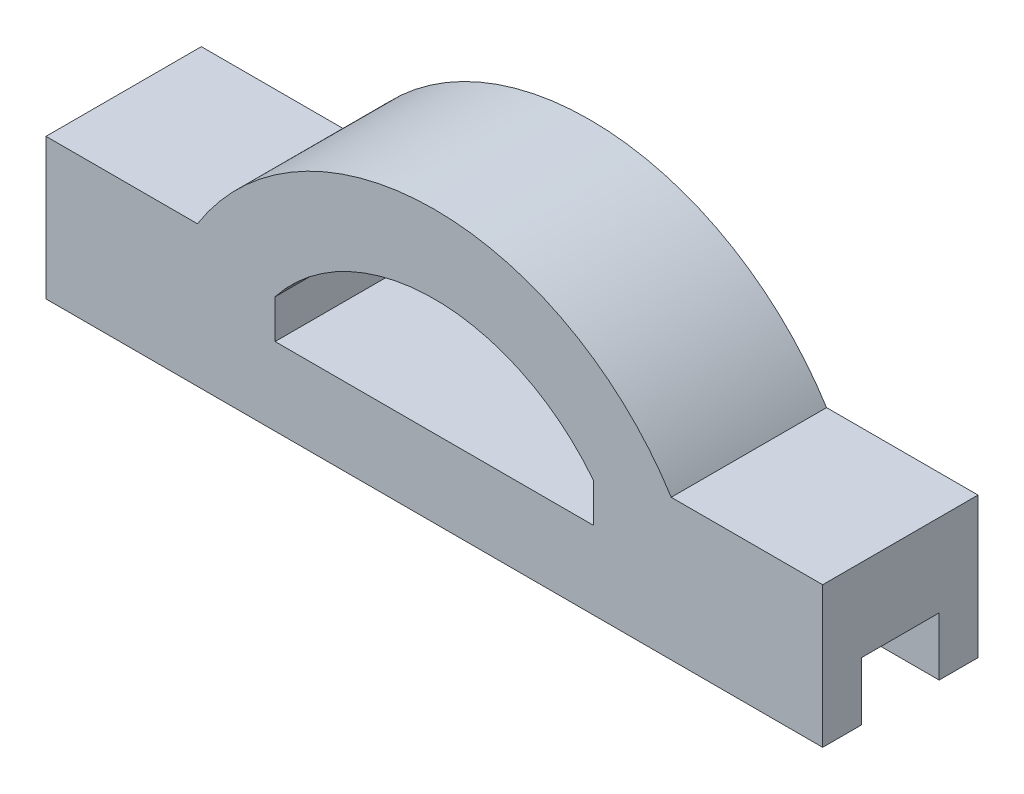
ISO-10303-21;
HEADER;
FILE_DESCRIPTION(('STEP AP214'),'2;1');
FILE_NAME('part.step','',(''),(''),'','','');
FILE_SCHEMA(('AUTOMOTIVE_DESIGN { 1 0 10303 214 1 1 1 1 }'));
ENDSEC;
DATA;
#1=APPLICATION_CONTEXT('core data for automotive mechanical design processes');
#2=APPLICATION_PROTOCOL_DEFINITION('international standard','automotive_design',2000,#1);
#3=PRODUCT_CONTEXT('',#1,'mechanical');
#4=PRODUCT('Part','Part','',(#3));
#5=PRODUCT_RELATED_PRODUCT_CATEGORY('part','',(#4));
#6=PRODUCT_DEFINITION_FORMATION('','',#4);
#7=PRODUCT_DEFINITION_CONTEXT('part definition',#1,'design');
#8=PRODUCT_DEFINITION('design','',#6,#7);
#9=PRODUCT_DEFINITION_SHAPE('','',#8);
#10=(LENGTH_UNIT() NAMED_UNIT(*) SI_UNIT(.MILLI.,.METRE.));
#11=(NAMED_UNIT(*) PLANE_ANGLE_UNIT() SI_UNIT($,.RADIAN.));
#12=(NAMED_UNIT(*) SI_UNIT($,.STERADIAN.) SOLID_ANGLE_UNIT());
#13=UNCERTAINTY_MEASURE_WITH_UNIT(LENGTH_MEASURE(1.E-05),#10,'distance_accuracy_value','');
#14=(GEOMETRIC_REPRESENTATION_CONTEXT(3) GLOBAL_UNCERTAINTY_ASSIGNED_CONTEXT((#13)) GLOBAL_UNIT_ASSIGNED_CONTEXT((#10,
#11,#12)) REPRESENTATION_CONTEXT('',''));
#15=CARTESIAN_POINT('',(0.,0.,0.));
#16=DIRECTION('',(0.,0.,1.));
#17=DIRECTION('',(1.,0.,0.));
#18=AXIS2_PLACEMENT_3D('',#15,#16,#17);
#19=CARTESIAN_POINT('',(20.,0.,-2.));
#20=DIRECTION('',(1.,0.,0.));
#21=DIRECTION('',(0.,0.,-1.));
#22=AXIS2_PLACEMENT_3D('',#19,#20,#21);
#23=PLANE('',#22);
#24=DIRECTION('',(0.,0.,-1.));
#25=VECTOR('',#24,1.);
#26=CARTESIAN_POINT('',(20.,1.5,1.));
#27=LINE('',#26,#25);
#28=CARTESIAN_POINT('',(20.,1.5,1.));
#29=VERTEX_POINT('',#28);
#30=CARTESIAN_POINT('',(20.,1.5,-1.));
#31=VERTEX_POINT('',#30);
#32=EDGE_CURVE('E184',#29,#31,#27,.T.);
#33=ORIENTED_EDGE('',*,*,#32,.T.);
#34=DIRECTION('',(0.,-1.,0.));
#35=VECTOR('',#34,1.);
#36=CARTESIAN_POINT('',(20.,0.,-1.));
#37=LINE('',#36,#35);
#38=CARTESIAN_POINT('',(20.,0.,-1.));
#39=VERTEX_POINT('',#38);
#40=EDGE_CURVE('E175',#31,#39,#37,.T.);
#41=ORIENTED_EDGE('',*,*,#40,.T.);
#42=DIRECTION('',(0.,0.,1.));
#43=VECTOR('',#42,1.);
#44=CARTESIAN_POINT('',(20.,0.,-2.));
#45=LINE('',#44,#43);
#46=CARTESIAN_POINT('',(20.,0.,-2.));
#47=VERTEX_POINT('',#46);
#48=EDGE_CURVE('E295',#47,#39,#45,.T.);
#49=ORIENTED_EDGE('',*,*,#48,.F.);
#50=DIRECTION('',(0.,1.,0.));
#51=VECTOR('',#50,1.);
#52=CARTESIAN_POINT('',(20.,0.,-2.));
#53=LINE('',#52,#51);
#54=CARTESIAN_POINT('',(20.,3.62712220721575,-2.));
#55=VERTEX_POINT('',#54);
#56=EDGE_CURVE('E278',#47,#55,#53,.T.);
#57=ORIENTED_EDGE('',*,*,#56,.T.);
#58=DIRECTION('',(0.,0.,1.));
#59=VECTOR('',#58,1.);
#60=CARTESIAN_POINT('',(20.,3.62712220721575,-2.));
#61=LINE('',#60,#59);
#62=CARTESIAN_POINT('',(20.,3.62712220721575,2.));
#63=VERTEX_POINT('',#62);
#64=EDGE_CURVE('E294',#55,#63,#61,.T.);
#65=ORIENTED_EDGE('',*,*,#64,.T.);
#66=DIRECTION('',(0.,1.,0.));
#67=VECTOR('',#66,1.);
#68=CARTESIAN_POINT('',(20.,0.,2.));
#69=LINE('',#68,#67);
#70=CARTESIAN_POINT('',(20.,0.,2.));
#71=VERTEX_POINT('',#70);
#72=EDGE_CURVE('E240',#71,#63,#69,.T.);
#73=ORIENTED_EDGE('',*,*,#72,.F.);
#74=CARTESIAN_POINT('',(20.,0.,1.));
#75=VERTEX_POINT('',#74);
#76=EDGE_CURVE('E297',#75,#71,#45,.T.);
#77=ORIENTED_EDGE('',*,*,#76,.F.);
#78=DIRECTION('',(0.,1.,0.));
#79=VECTOR('',#78,1.);
#80=CARTESIAN_POINT('',(20.,0.,1.));
#81=LINE('',#80,#79);
#82=EDGE_CURVE('E181',#75,#29,#81,.T.);
#83=ORIENTED_EDGE('',*,*,#82,.T.);
#84=EDGE_LOOP('',(#33,#41,#49,#57,#65,#73,#77,#83));
#85=FACE_BOUND('',#84,.T.);
#86=ADVANCED_FACE('F33',(#85),#23,.T.);
#87=CARTESIAN_POINT('',(0.,0.,-2.));
#88=DIRECTION('',(0.,-1.,0.));
#89=DIRECTION('',(0.,0.,-1.));
#90=AXIS2_PLACEMENT_3D('',#87,#88,#89);
#91=PLANE('',#90);
#92=ORIENTED_EDGE('',*,*,#48,.T.);
#93=DIRECTION('',(1.,0.,0.));
#94=VECTOR('',#93,1.);
#95=CARTESIAN_POINT('',(18.,0.,-1.));
#96=LINE('',#95,#94);
#97=CARTESIAN_POINT('',(18.,0.,-1.));
#98=VERTEX_POINT('',#97);
#99=EDGE_CURVE('E191',#98,#39,#96,.T.);
#100=ORIENTED_EDGE('',*,*,#99,.F.);
#101=DIRECTION('',(0.,0.,1.));
#102=VECTOR('',#101,1.);
#103=CARTESIAN_POINT('',(18.,0.,-1.));
#104=LINE('',#103,#102);
#105=CARTESIAN_POINT('',(18.,0.,1.));
#106=VERTEX_POINT('',#105);
#107=EDGE_CURVE('E177',#98,#106,#104,.T.);
#108=ORIENTED_EDGE('',*,*,#107,.T.);
#109=DIRECTION('',(1.,0.,0.));
#110=VECTOR('',#109,1.);
#111=CARTESIAN_POINT('',(18.,0.,1.));
#112=LINE('',#111,#110);
#113=EDGE_CURVE('E194',#106,#75,#112,.T.);
#114=ORIENTED_EDGE('',*,*,#113,.T.);
#115=ORIENTED_EDGE('',*,*,#76,.T.);
#116=DIRECTION('',(1.,0.,0.));
#117=VECTOR('',#116,1.);
#118=CARTESIAN_POINT('',(0.,0.,2.));
#119=LINE('',#118,#117);
#120=CARTESIAN_POINT('',(0.,0.,2.));
#121=VERTEX_POINT('',#120);
#122=EDGE_CURVE('E237',#121,#71,#119,.T.);
#123=ORIENTED_EDGE('',*,*,#122,.F.);
#124=DIRECTION('',(0.,0.,1.));
#125=VECTOR('',#124,1.);
#126=CARTESIAN_POINT('',(0.,0.,-2.));
#127=LINE('',#126,#125);
#128=CARTESIAN_POINT('',(0.,0.,1.));
#129=VERTEX_POINT('',#128);
#130=EDGE_CURVE('E289',#129,#121,#127,.T.);
#131=ORIENTED_EDGE('',*,*,#130,.F.);
#132=DIRECTION('',(-1.,0.,0.));
#133=VECTOR('',#132,1.);
#134=CARTESIAN_POINT('',(2.,0.,1.));
#135=LINE('',#134,#133);
#136=CARTESIAN_POINT('',(2.,0.,1.));
#137=VERTEX_POINT('',#136);
#138=EDGE_CURVE('E219',#137,#129,#135,.T.);
#139=ORIENTED_EDGE('',*,*,#138,.F.);
#140=DIRECTION('',(0.,0.,1.));
#141=VECTOR('',#140,1.);
#142=CARTESIAN_POINT('',(2.,0.,-1.));
#143=LINE('',#142,#141);
#144=CARTESIAN_POINT('',(2.,0.,-1.));
#145=VERTEX_POINT('',#144);
#146=EDGE_CURVE('E199',#145,#137,#143,.T.);
#147=ORIENTED_EDGE('',*,*,#146,.F.);
#148=DIRECTION('',(-1.,0.,0.));
#149=VECTOR('',#148,1.);
#150=CARTESIAN_POINT('',(2.,0.,-1.));
#151=LINE('',#150,#149);
#152=CARTESIAN_POINT('',(0.,0.,-1.));
#153=VERTEX_POINT('',#152);
#154=EDGE_CURVE('E207',#145,#153,#151,.T.);
#155=ORIENTED_EDGE('',*,*,#154,.T.);
#156=CARTESIAN_POINT('',(0.,0.,-2.));
#157=VERTEX_POINT('',#156);
#158=EDGE_CURVE('E37',#157,#153,#127,.T.);
#159=ORIENTED_EDGE('',*,*,#158,.F.);
#160=DIRECTION('',(1.,0.,0.));
#161=VECTOR('',#160,1.);
#162=CARTESIAN_POINT('',(0.,0.,-2.));
#163=LINE('',#162,#161);
#164=EDGE_CURVE('E275',#157,#47,#163,.T.);
#165=ORIENTED_EDGE('',*,*,#164,.T.);
#166=EDGE_LOOP('',(#92,#100,#108,#114,#115,#123,#131,#139,#147,#155,#159,#165));
#167=FACE_BOUND('',#166,.T.);
#168=ADVANCED_FACE('F35',(#167),#91,.T.);
#169=CARTESIAN_POINT('',(0.,3.62712220721575,-2.));
#170=DIRECTION('',(-1.,0.,0.));
#171=DIRECTION('',(0.,-1.,0.));
#172=AXIS2_PLACEMENT_3D('',#169,#170,#171);
#173=PLANE('',#172);
#174=DIRECTION('',(0.,-1.,0.));
#175=VECTOR('',#174,1.);
#176=CARTESIAN_POINT('',(0.,0.,-1.));
#177=LINE('',#176,#175);
#178=CARTESIAN_POINT('',(0.,1.5,-1.));
#179=VERTEX_POINT('',#178);
#180=EDGE_CURVE('E193',#179,#153,#177,.T.);
#181=ORIENTED_EDGE('',*,*,#180,.F.);
#182=DIRECTION('',(0.,0.,-1.));
#183=VECTOR('',#182,1.);
#184=CARTESIAN_POINT('',(0.,1.5,1.));
#185=LINE('',#184,#183);
#186=CARTESIAN_POINT('',(0.,1.5,1.));
#187=VERTEX_POINT('',#186);
#188=EDGE_CURVE('E200',#187,#179,#185,.T.);
#189=ORIENTED_EDGE('',*,*,#188,.F.);
#190=DIRECTION('',(0.,1.,0.));
#191=VECTOR('',#190,1.);
#192=CARTESIAN_POINT('',(0.,0.,1.));
#193=LINE('',#192,#191);
#194=EDGE_CURVE('E209',#129,#187,#193,.T.);
#195=ORIENTED_EDGE('',*,*,#194,.F.);
#196=ORIENTED_EDGE('',*,*,#130,.T.);
#197=DIRECTION('',(0.,-1.,0.));
#198=VECTOR('',#197,1.);
#199=CARTESIAN_POINT('',(0.,2.,2.));
#200=LINE('',#199,#198);
#201=CARTESIAN_POINT('',(0.,3.62712220721575,2.));
#202=VERTEX_POINT('',#201);
#203=EDGE_CURVE('E234',#202,#121,#200,.T.);
#204=ORIENTED_EDGE('',*,*,#203,.F.);
#205=DIRECTION('',(0.,0.,1.));
#206=VECTOR('',#205,1.);
#207=CARTESIAN_POINT('',(0.,3.62712220721575,-2.));
#208=LINE('',#207,#206);
#209=CARTESIAN_POINT('',(0.,3.62712220721575,-2.));
#210=VERTEX_POINT('',#209);
#211=EDGE_CURVE('E11',#210,#202,#208,.T.);
#212=ORIENTED_EDGE('',*,*,#211,.F.);
#213=DIRECTION('',(0.,-1.,0.));
#214=VECTOR('',#213,1.);
#215=CARTESIAN_POINT('',(0.,2.,-2.));
#216=LINE('',#215,#214);
#217=EDGE_CURVE('E267',#210,#157,#216,.T.);
#218=ORIENTED_EDGE('',*,*,#217,.T.);
#219=ORIENTED_EDGE('',*,*,#158,.T.);
#220=EDGE_LOOP('',(#181,#189,#195,#196,#204,#212,#218,#219));
#221=FACE_BOUND('',#220,.T.);
#222=ADVANCED_FACE('F307',(#221),#173,.T.);
#223=CARTESIAN_POINT('',(0.,3.62712220721575,-2.));
#224=DIRECTION('',(0.,1.,0.));
#225=DIRECTION('',(0.,0.,1.));
#226=AXIS2_PLACEMENT_3D('',#223,#224,#225);
#227=PLANE('',#226);
#228=ORIENTED_EDGE('',*,*,#211,.T.);
#229=DIRECTION('',(-1.,0.,0.));
#230=VECTOR('',#229,1.);
#231=CARTESIAN_POINT('',(0.,3.62712220721575,2.));
#232=LINE('',#231,#230);
#233=CARTESIAN_POINT('',(3.9,3.62712220721574,2.));
#234=VERTEX_POINT('',#233);
#235=EDGE_CURVE('E249',#234,#202,#232,.T.);
#236=ORIENTED_EDGE('',*,*,#235,.F.);
#237=DIRECTION('',(0.,0.,1.));
#238=VECTOR('',#237,1.);
#239=CARTESIAN_POINT('',(3.9,3.62712220721574,-2.));
#240=LINE('',#239,#238);
#241=CARTESIAN_POINT('',(3.9,3.62712220721574,-2.));
#242=VERTEX_POINT('',#241);
#243=EDGE_CURVE('E42',#242,#234,#240,.T.);
#244=ORIENTED_EDGE('',*,*,#243,.F.);
#245=DIRECTION('',(-1.,0.,0.));
#246=VECTOR('',#245,1.);
#247=CARTESIAN_POINT('',(0.,3.62712220721575,-2.));
#248=LINE('',#247,#246);
#249=EDGE_CURVE('E287',#242,#210,#248,.T.);
#250=ORIENTED_EDGE('',*,*,#249,.T.);
#251=EDGE_LOOP('',(#228,#236,#244,#250));
#252=FACE_BOUND('',#251,.T.);
#253=ADVANCED_FACE('F318',(#252),#227,.T.);
#254=CARTESIAN_POINT('',(10.,-0.202499999999999,-2.));
#255=DIRECTION('',(0.,0.,1.));
#256=DIRECTION('',(1.,0.,0.));
#257=AXIS2_PLACEMENT_3D('',#254,#255,#256);
#258=CYLINDRICAL_SURFACE('',#257,7.2025);
#259=ORIENTED_EDGE('',*,*,#243,.T.);
#260=CARTESIAN_POINT('',(10.,-0.202499999999999,2.));
#261=DIRECTION('',(0.,0.,1.));
#262=DIRECTION('',(1.,0.,0.));
#263=AXIS2_PLACEMENT_3D('',#260,#261,#262);
#264=CIRCLE('',#263,7.2025);
#265=CARTESIAN_POINT('',(16.1,3.62712220721575,2.));
#266=VERTEX_POINT('',#265);
#267=EDGE_CURVE('E246',#266,#234,#264,.T.);
#268=ORIENTED_EDGE('',*,*,#267,.F.);
#269=DIRECTION('',(0.,0.,1.));
#270=VECTOR('',#269,1.);
#271=CARTESIAN_POINT('',(16.1,3.62712220721575,-2.));
#272=LINE('',#271,#270);
#273=CARTESIAN_POINT('',(16.1,3.62712220721575,-2.));
#274=VERTEX_POINT('',#273);
#275=EDGE_CURVE('E292',#274,#266,#272,.T.);
#276=ORIENTED_EDGE('',*,*,#275,.F.);
#277=CARTESIAN_POINT('',(10.,-0.202499999999999,-2.));
#278=DIRECTION('',(0.,0.,1.));
#279=DIRECTION('',(1.,0.,0.));
#280=AXIS2_PLACEMENT_3D('',#277,#278,#279);
#281=CIRCLE('',#280,7.2025);
#282=EDGE_CURVE('E284',#274,#242,#281,.T.);
#283=ORIENTED_EDGE('',*,*,#282,.T.);
#284=EDGE_LOOP('',(#259,#268,#276,#283));
#285=FACE_BOUND('',#284,.T.);
#286=ADVANCED_FACE('F354',(#285),#258,.T.);
#287=CARTESIAN_POINT('',(16.1,3.62712220721575,-2.));
#288=DIRECTION('',(0.,1.,0.));
#289=DIRECTION('',(0.,0.,1.));
#290=AXIS2_PLACEMENT_3D('',#287,#288,#289);
#291=PLANE('',#290);
#292=ORIENTED_EDGE('',*,*,#275,.T.);
#293=DIRECTION('',(-1.,0.,0.));
#294=VECTOR('',#293,1.);
#295=CARTESIAN_POINT('',(16.1,3.62712220721575,2.));
#296=LINE('',#295,#294);
#297=EDGE_CURVE('E243',#63,#266,#296,.T.);
#298=ORIENTED_EDGE('',*,*,#297,.F.);
#299=ORIENTED_EDGE('',*,*,#64,.F.);
#300=DIRECTION('',(-1.,0.,0.));
#301=VECTOR('',#300,1.);
#302=CARTESIAN_POINT('',(16.1,3.62712220721575,-2.));
#303=LINE('',#302,#301);
#304=EDGE_CURVE('E281',#55,#274,#303,.T.);
#305=ORIENTED_EDGE('',*,*,#304,.T.);
#306=EDGE_LOOP('',(#292,#298,#299,#305));
#307=FACE_BOUND('',#306,.T.);
#308=ADVANCED_FACE('F351',(#307),#291,.T.);
#309=CARTESIAN_POINT('',(10.,-0.202499999999999,-2.));
#310=DIRECTION('',(0.,0.,1.));
#311=DIRECTION('',(1.,0.,0.));
#312=AXIS2_PLACEMENT_3D('',#309,#310,#311);
#313=PLANE('',#312);
#314=DIRECTION('',(0.,-1.,0.));
#315=VECTOR('',#314,1.);
#316=CARTESIAN_POINT('',(5.9,2.,-2.));
#317=LINE('',#316,#315);
#318=CARTESIAN_POINT('',(5.9,3.,-2.));
#319=VERTEX_POINT('',#318);
#320=CARTESIAN_POINT('',(5.9,2.,-2.));
#321=VERTEX_POINT('',#320);
#322=EDGE_CURVE('E261',#319,#321,#317,.T.);
#323=ORIENTED_EDGE('',*,*,#322,.T.);
#324=DIRECTION('',(1.,0.,0.));
#325=VECTOR('',#324,1.);
#326=CARTESIAN_POINT('',(5.9,2.,-2.));
#327=LINE('',#326,#325);
#328=CARTESIAN_POINT('',(14.1,2.,-2.));
#329=VERTEX_POINT('',#328);
#330=EDGE_CURVE('E252',#321,#329,#327,.T.);
#331=ORIENTED_EDGE('',*,*,#330,.T.);
#332=DIRECTION('',(0.,1.,0.));
#333=VECTOR('',#332,1.);
#334=CARTESIAN_POINT('',(14.1,2.,-2.));
#335=LINE('',#334,#333);
#336=CARTESIAN_POINT('',(14.1,3.,-2.));
#337=VERTEX_POINT('',#336);
#338=EDGE_CURVE('E255',#329,#337,#335,.T.);
#339=ORIENTED_EDGE('',*,*,#338,.T.);
#340=CARTESIAN_POINT('',(10.,-0.202499999999999,-2.));
#341=DIRECTION('',(0.,0.,1.));
#342=DIRECTION('',(1.,0.,0.));
#343=AXIS2_PLACEMENT_3D('',#340,#341,#342);
#344=CIRCLE('',#343,5.2025);
#345=EDGE_CURVE('E258',#337,#319,#344,.T.);
#346=ORIENTED_EDGE('',*,*,#345,.T.);
#347=EDGE_LOOP('',(#323,#331,#339,#346));
#348=FACE_BOUND('',#347,.T.);
#349=ORIENTED_EDGE('',*,*,#217,.F.);
#350=ORIENTED_EDGE('',*,*,#249,.F.);
#351=ORIENTED_EDGE('',*,*,#282,.F.);
#352=ORIENTED_EDGE('',*,*,#304,.F.);
#353=ORIENTED_EDGE('',*,*,#56,.F.);
#354=ORIENTED_EDGE('',*,*,#164,.F.);
#355=EDGE_LOOP('',(#349,#350,#351,#352,#353,#354));
#356=FACE_BOUND('',#355,.T.);
#357=ADVANCED_FACE('F322',(#348,#356),#313,.F.);
#358=CARTESIAN_POINT('',(5.9,2.,-2.));
#359=DIRECTION('',(0.,-1.,0.));
#360=DIRECTION('',(0.,0.,-1.));
#361=AXIS2_PLACEMENT_3D('',#358,#359,#360);
#362=PLANE('',#361);
#363=DIRECTION('',(0.,0.,1.));
#364=VECTOR('',#363,1.);
#365=CARTESIAN_POINT('',(5.9,2.,-2.));
#366=LINE('',#365,#364);
#367=CARTESIAN_POINT('',(5.9,2.,2.));
#368=VERTEX_POINT('',#367);
#369=EDGE_CURVE('E265',#321,#368,#366,.T.);
#370=ORIENTED_EDGE('',*,*,#369,.T.);
#371=DIRECTION('',(1.,0.,0.));
#372=VECTOR('',#371,1.);
#373=CARTESIAN_POINT('',(5.9,2.,2.));
#374=LINE('',#373,#372);
#375=CARTESIAN_POINT('',(14.1,2.,2.));
#376=VERTEX_POINT('',#375);
#377=EDGE_CURVE('E216',#368,#376,#374,.T.);
#378=ORIENTED_EDGE('',*,*,#377,.T.);
#379=DIRECTION('',(0.,0.,1.));
#380=VECTOR('',#379,1.);
#381=CARTESIAN_POINT('',(14.1,2.,-2.));
#382=LINE('',#381,#380);
#383=EDGE_CURVE('E264',#329,#376,#382,.T.);
#384=ORIENTED_EDGE('',*,*,#383,.F.);
#385=ORIENTED_EDGE('',*,*,#330,.F.);
#386=EDGE_LOOP('',(#370,#378,#384,#385));
#387=FACE_BOUND('',#386,.T.);
#388=ADVANCED_FACE('F365',(#387),#362,.F.);
#389=CARTESIAN_POINT('',(5.9,2.,-2.));
#390=DIRECTION('',(-1.,0.,0.));
#391=DIRECTION('',(0.,-1.,0.));
#392=AXIS2_PLACEMENT_3D('',#389,#390,#391);
#393=PLANE('',#392);
#394=DIRECTION('',(0.,0.,1.));
#395=VECTOR('',#394,1.);
#396=CARTESIAN_POINT('',(5.9,3.,-2.));
#397=LINE('',#396,#395);
#398=CARTESIAN_POINT('',(5.9,3.,2.));
#399=VERTEX_POINT('',#398);
#400=EDGE_CURVE('E268',#319,#399,#397,.T.);
#401=ORIENTED_EDGE('',*,*,#400,.T.);
#402=DIRECTION('',(0.,-1.,0.));
#403=VECTOR('',#402,1.);
#404=CARTESIAN_POINT('',(5.9,2.,2.));
#405=LINE('',#404,#403);
#406=EDGE_CURVE('E231',#399,#368,#405,.T.);
#407=ORIENTED_EDGE('',*,*,#406,.T.);
#408=ORIENTED_EDGE('',*,*,#369,.F.);
#409=ORIENTED_EDGE('',*,*,#322,.F.);
#410=EDGE_LOOP('',(#401,#407,#408,#409));
#411=FACE_BOUND('',#410,.T.);
#412=ADVANCED_FACE('F369',(#411),#393,.F.);
#413=CARTESIAN_POINT('',(10.,-0.202499999999999,-2.));
#414=DIRECTION('',(0.,0.,1.));
#415=DIRECTION('',(1.,0.,0.));
#416=AXIS2_PLACEMENT_3D('',#413,#414,#415);
#417=CYLINDRICAL_SURFACE('',#416,5.2025);
#418=DIRECTION('',(0.,0.,1.));
#419=VECTOR('',#418,1.);
#420=CARTESIAN_POINT('',(14.1,3.,-2.));
#421=LINE('',#420,#419);
#422=CARTESIAN_POINT('',(14.1,3.,2.));
#423=VERTEX_POINT('',#422);
#424=EDGE_CURVE('E270',#337,#423,#421,.T.);
#425=ORIENTED_EDGE('',*,*,#424,.T.);
#426=CARTESIAN_POINT('',(10.,-0.202499999999999,2.));
#427=DIRECTION('',(0.,0.,1.));
#428=DIRECTION('',(1.,0.,0.));
#429=AXIS2_PLACEMENT_3D('',#426,#427,#428);
#430=CIRCLE('',#429,5.2025);
#431=EDGE_CURVE('E228',#423,#399,#430,.T.);
#432=ORIENTED_EDGE('',*,*,#431,.T.);
#433=ORIENTED_EDGE('',*,*,#400,.F.);
#434=ORIENTED_EDGE('',*,*,#345,.F.);
#435=EDGE_LOOP('',(#425,#432,#433,#434));
#436=FACE_BOUND('',#435,.T.);
#437=ADVANCED_FACE('F374',(#436),#417,.F.);
#438=CARTESIAN_POINT('',(14.1,2.,-2.));
#439=DIRECTION('',(1.,0.,0.));
#440=DIRECTION('',(0.,1.,0.));
#441=AXIS2_PLACEMENT_3D('',#438,#439,#440);
#442=PLANE('',#441);
#443=ORIENTED_EDGE('',*,*,#383,.T.);
#444=DIRECTION('',(0.,1.,0.));
#445=VECTOR('',#444,1.);
#446=CARTESIAN_POINT('',(14.1,2.,2.));
#447=LINE('',#446,#445);
#448=EDGE_CURVE('E225',#376,#423,#447,.T.);
#449=ORIENTED_EDGE('',*,*,#448,.T.);
#450=ORIENTED_EDGE('',*,*,#424,.F.);
#451=ORIENTED_EDGE('',*,*,#338,.F.);
#452=EDGE_LOOP('',(#443,#449,#450,#451));
#453=FACE_BOUND('',#452,.T.);
#454=ADVANCED_FACE('F371',(#453),#442,.F.);
#455=CARTESIAN_POINT('',(10.,-0.202499999999999,2.));
#456=DIRECTION('',(0.,0.,1.));
#457=DIRECTION('',(1.,0.,0.));
#458=AXIS2_PLACEMENT_3D('',#455,#456,#457);
#459=PLANE('',#458);
#460=ORIENTED_EDGE('',*,*,#203,.T.);
#461=ORIENTED_EDGE('',*,*,#122,.T.);
#462=ORIENTED_EDGE('',*,*,#72,.T.);
#463=ORIENTED_EDGE('',*,*,#297,.T.);
#464=ORIENTED_EDGE('',*,*,#267,.T.);
#465=ORIENTED_EDGE('',*,*,#235,.T.);
#466=EDGE_LOOP('',(#460,#461,#462,#463,#464,#465));
#467=FACE_BOUND('',#466,.T.);
#468=ORIENTED_EDGE('',*,*,#448,.F.);
#469=ORIENTED_EDGE('',*,*,#377,.F.);
#470=ORIENTED_EDGE('',*,*,#406,.F.);
#471=ORIENTED_EDGE('',*,*,#431,.F.);
#472=EDGE_LOOP('',(#468,#469,#470,#471));
#473=FACE_BOUND('',#472,.T.);
#474=ADVANCED_FACE('F313',(#467,#473),#459,.T.);
#475=CARTESIAN_POINT('',(2.,0.,-1.));
#476=DIRECTION('',(0.,0.,-1.));
#477=DIRECTION('',(0.,1.,0.));
#478=AXIS2_PLACEMENT_3D('',#475,#476,#477);
#479=PLANE('',#478);
#480=ORIENTED_EDGE('',*,*,#180,.T.);
#481=ORIENTED_EDGE('',*,*,#154,.F.);
#482=DIRECTION('',(0.,-1.,0.));
#483=VECTOR('',#482,1.);
#484=CARTESIAN_POINT('',(2.,0.,-1.));
#485=LINE('',#484,#483);
#486=CARTESIAN_POINT('',(2.,1.5,-1.));
#487=VERTEX_POINT('',#486);
#488=EDGE_CURVE('E58',#487,#145,#485,.T.);
#489=ORIENTED_EDGE('',*,*,#488,.F.);
#490=DIRECTION('',(-1.,0.,0.));
#491=VECTOR('',#490,1.);
#492=CARTESIAN_POINT('',(2.,1.5,-1.));
#493=LINE('',#492,#491);
#494=EDGE_CURVE('E214',#487,#179,#493,.T.);
#495=ORIENTED_EDGE('',*,*,#494,.T.);
#496=EDGE_LOOP('',(#480,#481,#489,#495));
#497=FACE_BOUND('',#496,.T.);
#498=ADVANCED_FACE('F328',(#497),#479,.F.);
#499=CARTESIAN_POINT('',(2.,1.5,1.));
#500=DIRECTION('',(0.,1.,0.));
#501=DIRECTION('',(0.,0.,1.));
#502=AXIS2_PLACEMENT_3D('',#499,#500,#501);
#503=PLANE('',#502);
#504=ORIENTED_EDGE('',*,*,#188,.T.);
#505=ORIENTED_EDGE('',*,*,#494,.F.);
#506=DIRECTION('',(0.,0.,-1.));
#507=VECTOR('',#506,1.);
#508=CARTESIAN_POINT('',(2.,1.5,1.));
#509=LINE('',#508,#507);
#510=CARTESIAN_POINT('',(2.,1.5,1.));
#511=VERTEX_POINT('',#510);
#512=EDGE_CURVE('E205',#511,#487,#509,.T.);
#513=ORIENTED_EDGE('',*,*,#512,.F.);
#514=DIRECTION('',(-1.,0.,0.));
#515=VECTOR('',#514,1.);
#516=CARTESIAN_POINT('',(2.,1.5,1.));
#517=LINE('',#516,#515);
#518=EDGE_CURVE('E217',#511,#187,#517,.T.);
#519=ORIENTED_EDGE('',*,*,#518,.T.);
#520=EDGE_LOOP('',(#504,#505,#513,#519));
#521=FACE_BOUND('',#520,.T.);
#522=ADVANCED_FACE('F330',(#521),#503,.F.);
#523=CARTESIAN_POINT('',(2.,0.,1.));
#524=DIRECTION('',(0.,0.,1.));
#525=DIRECTION('',(0.,-1.,0.));
#526=AXIS2_PLACEMENT_3D('',#523,#524,#525);
#527=PLANE('',#526);
#528=ORIENTED_EDGE('',*,*,#194,.T.);
#529=ORIENTED_EDGE('',*,*,#518,.F.);
#530=DIRECTION('',(0.,1.,0.));
#531=VECTOR('',#530,1.);
#532=CARTESIAN_POINT('',(2.,0.,1.));
#533=LINE('',#532,#531);
#534=EDGE_CURVE('E202',#137,#511,#533,.T.);
#535=ORIENTED_EDGE('',*,*,#534,.F.);
#536=ORIENTED_EDGE('',*,*,#138,.T.);
#537=EDGE_LOOP('',(#528,#529,#535,#536));
#538=FACE_BOUND('',#537,.T.);
#539=ADVANCED_FACE('F333',(#538),#527,.F.);
#540=CARTESIAN_POINT('',(2.,0.,0.));
#541=DIRECTION('',(-1.,0.,0.));
#542=DIRECTION('',(0.,-1.,0.));
#543=AXIS2_PLACEMENT_3D('',#540,#541,#542);
#544=PLANE('',#543);
#545=ORIENTED_EDGE('',*,*,#488,.T.);
#546=ORIENTED_EDGE('',*,*,#146,.T.);
#547=ORIENTED_EDGE('',*,*,#534,.T.);
#548=ORIENTED_EDGE('',*,*,#512,.T.);
#549=EDGE_LOOP('',(#545,#546,#547,#548));
#550=FACE_BOUND('',#549,.T.);
#551=ADVANCED_FACE('F334',(#550),#544,.T.);
#552=CARTESIAN_POINT('',(18.,0.,-1.));
#553=DIRECTION('',(0.,0.,1.));
#554=DIRECTION('',(0.,-1.,0.));
#555=AXIS2_PLACEMENT_3D('',#552,#553,#554);
#556=PLANE('',#555);
#557=ORIENTED_EDGE('',*,*,#40,.F.);
#558=DIRECTION('',(1.,0.,0.));
#559=VECTOR('',#558,1.);
#560=CARTESIAN_POINT('',(18.,1.5,-1.));
#561=LINE('',#560,#559);
#562=CARTESIAN_POINT('',(18.,1.5,-1.));
#563=VERTEX_POINT('',#562);
#564=EDGE_CURVE('E164',#563,#31,#561,.T.);
#565=ORIENTED_EDGE('',*,*,#564,.F.);
#566=DIRECTION('',(0.,-1.,0.));
#567=VECTOR('',#566,1.);
#568=CARTESIAN_POINT('',(18.,0.,-1.));
#569=LINE('',#568,#567);
#570=EDGE_CURVE('E168',#563,#98,#569,.T.);
#571=ORIENTED_EDGE('',*,*,#570,.T.);
#572=ORIENTED_EDGE('',*,*,#99,.T.);
#573=EDGE_LOOP('',(#557,#565,#571,#572));
#574=FACE_BOUND('',#573,.T.);
#575=ADVANCED_FACE('F172',(#574),#556,.T.);
#576=CARTESIAN_POINT('',(18.,0.,1.));
#577=DIRECTION('',(0.,0.,-1.));
#578=DIRECTION('',(0.,1.,0.));
#579=AXIS2_PLACEMENT_3D('',#576,#577,#578);
#580=PLANE('',#579);
#581=ORIENTED_EDGE('',*,*,#82,.F.);
#582=ORIENTED_EDGE('',*,*,#113,.F.);
#583=DIRECTION('',(0.,1.,0.));
#584=VECTOR('',#583,1.);
#585=CARTESIAN_POINT('',(18.,0.,1.));
#586=LINE('',#585,#584);
#587=CARTESIAN_POINT('',(18.,1.5,1.));
#588=VERTEX_POINT('',#587);
#589=EDGE_CURVE('E50',#106,#588,#586,.T.);
#590=ORIENTED_EDGE('',*,*,#589,.T.);
#591=DIRECTION('',(1.,0.,0.));
#592=VECTOR('',#591,1.);
#593=CARTESIAN_POINT('',(18.,1.5,1.));
#594=LINE('',#593,#592);
#595=EDGE_CURVE('E166',#588,#29,#594,.T.);
#596=ORIENTED_EDGE('',*,*,#595,.T.);
#597=EDGE_LOOP('',(#581,#582,#590,#596));
#598=FACE_BOUND('',#597,.T.);
#599=ADVANCED_FACE('F341',(#598),#580,.T.);
#600=CARTESIAN_POINT('',(18.,1.5,1.));
#601=DIRECTION('',(0.,-1.,0.));
#602=DIRECTION('',(0.,0.,-1.));
#603=AXIS2_PLACEMENT_3D('',#600,#601,#602);
#604=PLANE('',#603);
#605=ORIENTED_EDGE('',*,*,#32,.F.);
#606=ORIENTED_EDGE('',*,*,#595,.F.);
#607=DIRECTION('',(0.,0.,-1.));
#608=VECTOR('',#607,1.);
#609=CARTESIAN_POINT('',(18.,1.5,1.));
#610=LINE('',#609,#608);
#611=EDGE_CURVE('E160',#588,#563,#610,.T.);
#612=ORIENTED_EDGE('',*,*,#611,.T.);
#613=ORIENTED_EDGE('',*,*,#564,.T.);
#614=EDGE_LOOP('',(#605,#606,#612,#613));
#615=FACE_BOUND('',#614,.T.);
#616=ADVANCED_FACE('F163',(#615),#604,.T.);
#617=CARTESIAN_POINT('',(18.,0.,0.));
#618=DIRECTION('',(1.,0.,0.));
#619=DIRECTION('',(0.,-1.,0.));
#620=AXIS2_PLACEMENT_3D('',#617,#618,#619);
#621=PLANE('',#620);
#622=ORIENTED_EDGE('',*,*,#570,.F.);
#623=ORIENTED_EDGE('',*,*,#611,.F.);
#624=ORIENTED_EDGE('',*,*,#589,.F.);
#625=ORIENTED_EDGE('',*,*,#107,.F.);
#626=EDGE_LOOP('',(#622,#623,#624,#625));
#627=FACE_BOUND('',#626,.T.);
#628=ADVANCED_FACE('F179',(#627),#621,.T.);
#629=CLOSED_SHELL('',(#86,#168,#222,#253,#286,#308,#357,#388,#412,#437,#454,#474,#498,#522,#539,
#551,#575,#599,#616,#628));
#630=MANIFOLD_SOLID_BREP('B2',#629);
#631=ADVANCED_BREP_SHAPE_REPRESENTATION('',(#18,#630),#14);
#632=SHAPE_DEFINITION_REPRESENTATION(#9,#631);
ENDSEC;
END-ISO-10303-21;
